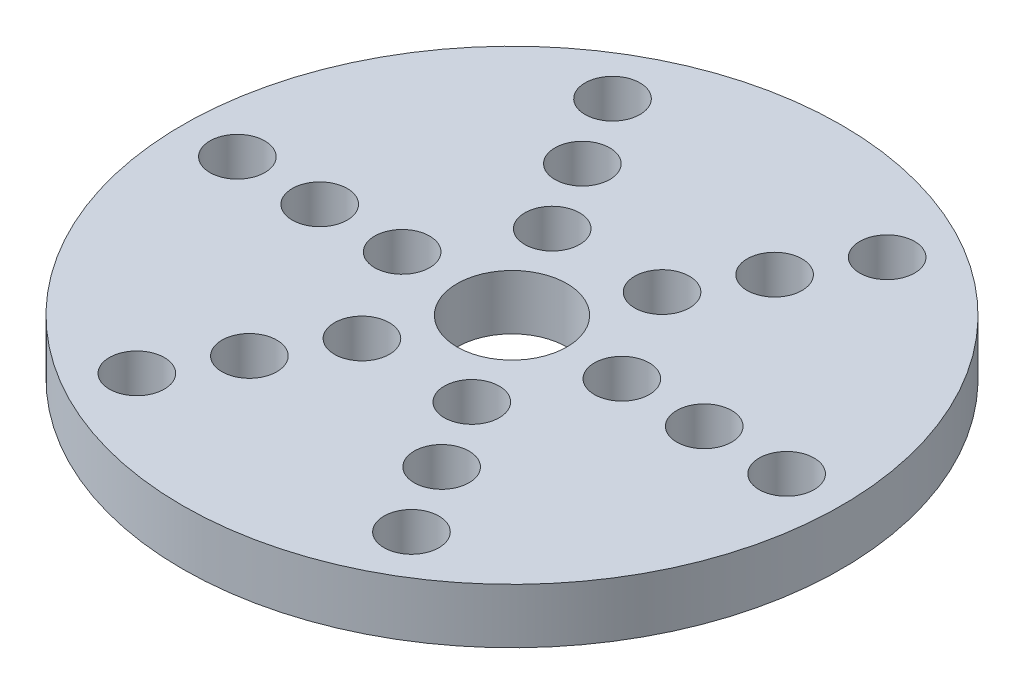
ISO-10303-21;
HEADER;
FILE_DESCRIPTION(('STEP AP214'),'2;1');
FILE_NAME('part.step','',(''),(''),'','','');
FILE_SCHEMA(('AUTOMOTIVE_DESIGN { 1 0 10303 214 1 1 1 1 }'));
ENDSEC;
DATA;
#1=APPLICATION_CONTEXT('core data for automotive mechanical design processes');
#2=APPLICATION_PROTOCOL_DEFINITION('international standard','automotive_design',2000,#1);
#3=PRODUCT_CONTEXT('',#1,'mechanical');
#4=PRODUCT('Part','Part','',(#3));
#5=PRODUCT_RELATED_PRODUCT_CATEGORY('part','',(#4));
#6=PRODUCT_DEFINITION_FORMATION('','',#4);
#7=PRODUCT_DEFINITION_CONTEXT('part definition',#1,'design');
#8=PRODUCT_DEFINITION('design','',#6,#7);
#9=PRODUCT_DEFINITION_SHAPE('','',#8);
#10=(LENGTH_UNIT() NAMED_UNIT(*) SI_UNIT(.MILLI.,.METRE.));
#11=(NAMED_UNIT(*) PLANE_ANGLE_UNIT() SI_UNIT($,.RADIAN.));
#12=(NAMED_UNIT(*) SI_UNIT($,.STERADIAN.) SOLID_ANGLE_UNIT());
#13=UNCERTAINTY_MEASURE_WITH_UNIT(LENGTH_MEASURE(1.E-05),#10,'distance_accuracy_value','');
#14=(GEOMETRIC_REPRESENTATION_CONTEXT(3) GLOBAL_UNCERTAINTY_ASSIGNED_CONTEXT((#13)) GLOBAL_UNIT_ASSIGNED_CONTEXT((#10,
#11,#12)) REPRESENTATION_CONTEXT('',''));
#15=CARTESIAN_POINT('',(0.,0.,0.));
#16=DIRECTION('',(0.,0.,1.));
#17=DIRECTION('',(1.,0.,0.));
#18=AXIS2_PLACEMENT_3D('',#15,#16,#17);
#19=CARTESIAN_POINT('',(0.,10.,0.));
#20=DIRECTION('',(0.,1.,0.));
#21=DIRECTION('',(0.,0.,1.));
#22=AXIS2_PLACEMENT_3D('',#19,#20,#21);
#23=PLANE('',#22);
#24=CARTESIAN_POINT('',(17.5000000000004,10.,-30.3108891324552));
#25=DIRECTION('',(0.,1.,0.));
#26=DIRECTION('',(0.,0.,1.));
#27=AXIS2_PLACEMENT_3D('',#24,#25,#26);
#28=CIRCLE('',#27,5.);
#29=CARTESIAN_POINT('',(17.5000000000004,10.,-25.3108891324552));
#30=VERTEX_POINT('',#29);
#31=EDGE_CURVE('E147',#30,#30,#28,.T.);
#32=ORIENTED_EDGE('',*,*,#31,.F.);
#33=EDGE_LOOP('',(#32));
#34=FACE_BOUND('',#33,.T.);
#35=CARTESIAN_POINT('',(-24.9999999999996,10.,-43.3012701892222));
#36=DIRECTION('',(0.,1.,0.));
#37=DIRECTION('',(0.,0.,1.));
#38=AXIS2_PLACEMENT_3D('',#35,#36,#37);
#39=CIRCLE('',#38,4.99999999999999);
#40=CARTESIAN_POINT('',(-24.9999999999996,10.,-38.3012701892222));
#41=VERTEX_POINT('',#40);
#42=EDGE_CURVE('E135',#41,#41,#39,.T.);
#43=ORIENTED_EDGE('',*,*,#42,.F.);
#44=EDGE_LOOP('',(#43));
#45=FACE_BOUND('',#44,.T.);
#46=CARTESIAN_POINT('',(-9.9999999999997,10.,-17.3205080756891));
#47=DIRECTION('',(0.,1.,0.));
#48=DIRECTION('',(0.,0.,1.));
#49=AXIS2_PLACEMENT_3D('',#46,#47,#48);
#50=CIRCLE('',#49,4.99999999999994);
#51=CARTESIAN_POINT('',(-9.9999999999997,10.,-12.3205080756892));
#52=VERTEX_POINT('',#51);
#53=EDGE_CURVE('E123',#52,#52,#50,.T.);
#54=ORIENTED_EDGE('',*,*,#53,.F.);
#55=EDGE_LOOP('',(#54));
#56=FACE_BOUND('',#55,.T.);
#57=CARTESIAN_POINT('',(-35.,10.,-2.44403693719019E-13));
#58=DIRECTION('',(0.,1.,0.));
#59=DIRECTION('',(0.,0.,1.));
#60=AXIS2_PLACEMENT_3D('',#57,#58,#59);
#61=CIRCLE('',#60,4.99999999999999);
#62=CARTESIAN_POINT('',(-35.,10.,4.99999999999975));
#63=VERTEX_POINT('',#62);
#64=EDGE_CURVE('E111',#63,#63,#61,.T.);
#65=ORIENTED_EDGE('',*,*,#64,.F.);
#66=EDGE_LOOP('',(#65));
#67=FACE_BOUND('',#66,.T.);
#68=CARTESIAN_POINT('',(-25.0000000000002,10.,43.3012701892218));
#69=DIRECTION('',(0.,1.,0.));
#70=DIRECTION('',(0.,0.,1.));
#71=AXIS2_PLACEMENT_3D('',#68,#69,#70);
#72=CIRCLE('',#71,5.);
#73=CARTESIAN_POINT('',(-25.0000000000002,10.,48.3012701892218));
#74=VERTEX_POINT('',#73);
#75=EDGE_CURVE('E99',#74,#74,#72,.T.);
#76=ORIENTED_EDGE('',*,*,#75,.F.);
#77=EDGE_LOOP('',(#76));
#78=FACE_BOUND('',#77,.T.);
#79=CARTESIAN_POINT('',(-10.0000000000001,10.,17.3205080756885));
#80=DIRECTION('',(0.,1.,0.));
#81=DIRECTION('',(0.,0.,1.));
#82=AXIS2_PLACEMENT_3D('',#79,#80,#81);
#83=CIRCLE('',#82,5.00000000000019);
#84=CARTESIAN_POINT('',(-10.0000000000001,10.,22.3205080756887));
#85=VERTEX_POINT('',#84);
#86=EDGE_CURVE('E87',#85,#85,#83,.T.);
#87=ORIENTED_EDGE('',*,*,#86,.F.);
#88=EDGE_LOOP('',(#87));
#89=FACE_BOUND('',#88,.T.);
#90=CARTESIAN_POINT('',(17.4999999999999,10.,30.3108891324554));
#91=DIRECTION('',(0.,1.,0.));
#92=DIRECTION('',(0.,0.,1.));
#93=AXIS2_PLACEMENT_3D('',#90,#91,#92);
#94=CIRCLE('',#93,5.);
#95=CARTESIAN_POINT('',(17.4999999999999,10.,35.3108891324554));
#96=VERTEX_POINT('',#95);
#97=EDGE_CURVE('E75',#96,#96,#94,.T.);
#98=ORIENTED_EDGE('',*,*,#97,.F.);
#99=EDGE_LOOP('',(#98));
#100=FACE_BOUND('',#99,.T.);
#101=CARTESIAN_POINT('',(50.,10.,0.));
#102=DIRECTION('',(0.,1.,0.));
#103=DIRECTION('',(0.,0.,1.));
#104=AXIS2_PLACEMENT_3D('',#101,#102,#103);
#105=CIRCLE('',#104,5.);
#106=CARTESIAN_POINT('',(50.,10.,5.));
#107=VERTEX_POINT('',#106);
#108=EDGE_CURVE('E63',#107,#107,#105,.T.);
#109=ORIENTED_EDGE('',*,*,#108,.F.);
#110=EDGE_LOOP('',(#109));
#111=FACE_BOUND('',#110,.T.);
#112=CARTESIAN_POINT('',(20.,10.,0.));
#113=DIRECTION('',(0.,1.,0.));
#114=DIRECTION('',(0.,0.,1.));
#115=AXIS2_PLACEMENT_3D('',#112,#113,#114);
#116=CIRCLE('',#115,5.);
#117=CARTESIAN_POINT('',(20.,10.,5.));
#118=VERTEX_POINT('',#117);
#119=EDGE_CURVE('E51',#118,#118,#116,.T.);
#120=ORIENTED_EDGE('',*,*,#119,.F.);
#121=EDGE_LOOP('',(#120));
#122=FACE_BOUND('',#121,.T.);
#123=CARTESIAN_POINT('',(0.,10.,0.));
#124=DIRECTION('',(0.,1.,0.));
#125=DIRECTION('',(0.,0.,1.));
#126=AXIS2_PLACEMENT_3D('',#123,#124,#125);
#127=CIRCLE('',#126,60.);
#128=CARTESIAN_POINT('',(0.,10.,60.));
#129=VERTEX_POINT('',#128);
#130=EDGE_CURVE('E10',#129,#129,#127,.T.);
#131=ORIENTED_EDGE('',*,*,#130,.T.);
#132=EDGE_LOOP('',(#131));
#133=FACE_BOUND('',#132,.T.);
#134=CARTESIAN_POINT('',(0.,10.,0.));
#135=DIRECTION('',(0.,1.,0.));
#136=DIRECTION('',(0.,0.,1.));
#137=AXIS2_PLACEMENT_3D('',#134,#135,#136);
#138=CIRCLE('',#137,10.);
#139=CARTESIAN_POINT('',(0.,10.,10.));
#140=VERTEX_POINT('',#139);
#141=EDGE_CURVE('E46',#140,#140,#138,.T.);
#142=ORIENTED_EDGE('',*,*,#141,.F.);
#143=EDGE_LOOP('',(#142));
#144=FACE_BOUND('',#143,.T.);
#145=CARTESIAN_POINT('',(35.,10.,0.));
#146=DIRECTION('',(0.,1.,0.));
#147=DIRECTION('',(0.,0.,1.));
#148=AXIS2_PLACEMENT_3D('',#145,#146,#147);
#149=CIRCLE('',#148,5.);
#150=CARTESIAN_POINT('',(35.,10.,5.));
#151=VERTEX_POINT('',#150);
#152=EDGE_CURVE('E57',#151,#151,#149,.T.);
#153=ORIENTED_EDGE('',*,*,#152,.F.);
#154=EDGE_LOOP('',(#153));
#155=FACE_BOUND('',#154,.T.);
#156=CARTESIAN_POINT('',(9.99999999999985,10.,17.3205080756887));
#157=DIRECTION('',(0.,1.,0.));
#158=DIRECTION('',(0.,0.,1.));
#159=AXIS2_PLACEMENT_3D('',#156,#157,#158);
#160=CIRCLE('',#159,5.00000000000015);
#161=CARTESIAN_POINT('',(9.99999999999985,10.,22.3205080756888));
#162=VERTEX_POINT('',#161);
#163=EDGE_CURVE('E69',#162,#162,#160,.T.);
#164=ORIENTED_EDGE('',*,*,#163,.F.);
#165=EDGE_LOOP('',(#164));
#166=FACE_BOUND('',#165,.T.);
#167=CARTESIAN_POINT('',(24.9999999999999,10.,43.301270189222));
#168=DIRECTION('',(0.,1.,0.));
#169=DIRECTION('',(0.,0.,1.));
#170=AXIS2_PLACEMENT_3D('',#167,#168,#169);
#171=CIRCLE('',#170,5.);
#172=CARTESIAN_POINT('',(24.9999999999999,10.,48.301270189222));
#173=VERTEX_POINT('',#172);
#174=EDGE_CURVE('E81',#173,#173,#171,.T.);
#175=ORIENTED_EDGE('',*,*,#174,.F.);
#176=EDGE_LOOP('',(#175));
#177=FACE_BOUND('',#176,.T.);
#178=CARTESIAN_POINT('',(-17.5000000000001,10.,30.3108891324553));
#179=DIRECTION('',(0.,1.,0.));
#180=DIRECTION('',(0.,0.,1.));
#181=AXIS2_PLACEMENT_3D('',#178,#179,#180);
#182=CIRCLE('',#181,5.);
#183=CARTESIAN_POINT('',(-17.5000000000001,10.,35.3108891324553));
#184=VERTEX_POINT('',#183);
#185=EDGE_CURVE('E93',#184,#184,#182,.T.);
#186=ORIENTED_EDGE('',*,*,#185,.F.);
#187=EDGE_LOOP('',(#186));
#188=FACE_BOUND('',#187,.T.);
#189=CARTESIAN_POINT('',(-20.,10.,-1.39659253553725E-13));
#190=DIRECTION('',(0.,1.,0.));
#191=DIRECTION('',(0.,0.,1.));
#192=AXIS2_PLACEMENT_3D('',#189,#190,#191);
#193=CIRCLE('',#192,5.);
#194=CARTESIAN_POINT('',(-20.,10.,4.99999999999986));
#195=VERTEX_POINT('',#194);
#196=EDGE_CURVE('E105',#195,#195,#193,.T.);
#197=ORIENTED_EDGE('',*,*,#196,.F.);
#198=EDGE_LOOP('',(#197));
#199=FACE_BOUND('',#198,.T.);
#200=CARTESIAN_POINT('',(-50.,10.,-3.49148133884313E-13));
#201=DIRECTION('',(0.,1.,0.));
#202=DIRECTION('',(0.,0.,1.));
#203=AXIS2_PLACEMENT_3D('',#200,#201,#202);
#204=CIRCLE('',#203,4.99999999999999);
#205=CARTESIAN_POINT('',(-50.,10.,4.99999999999964));
#206=VERTEX_POINT('',#205);
#207=EDGE_CURVE('E117',#206,#206,#204,.T.);
#208=ORIENTED_EDGE('',*,*,#207,.F.);
#209=EDGE_LOOP('',(#208));
#210=FACE_BOUND('',#209,.T.);
#211=CARTESIAN_POINT('',(-17.4999999999997,10.,-30.3108891324555));
#212=DIRECTION('',(0.,1.,0.));
#213=DIRECTION('',(0.,0.,1.));
#214=AXIS2_PLACEMENT_3D('',#211,#212,#213);
#215=CIRCLE('',#214,5.);
#216=CARTESIAN_POINT('',(-17.4999999999997,10.,-25.3108891324555));
#217=VERTEX_POINT('',#216);
#218=EDGE_CURVE('E129',#217,#217,#215,.T.);
#219=ORIENTED_EDGE('',*,*,#218,.F.);
#220=EDGE_LOOP('',(#219));
#221=FACE_BOUND('',#220,.T.);
#222=CARTESIAN_POINT('',(10.0000000000001,10.,-17.3205080756889));
#223=DIRECTION('',(0.,1.,0.));
#224=DIRECTION('',(0.,0.,1.));
#225=AXIS2_PLACEMENT_3D('',#222,#223,#224);
#226=CIRCLE('',#225,4.99999999999981);
#227=CARTESIAN_POINT('',(10.0000000000001,10.,-12.3205080756891));
#228=VERTEX_POINT('',#227);
#229=EDGE_CURVE('E141',#228,#228,#226,.T.);
#230=ORIENTED_EDGE('',*,*,#229,.F.);
#231=EDGE_LOOP('',(#230));
#232=FACE_BOUND('',#231,.T.);
#233=CARTESIAN_POINT('',(25.0000000000005,10.,-43.3012701892216));
#234=DIRECTION('',(0.,1.,0.));
#235=DIRECTION('',(0.,0.,1.));
#236=AXIS2_PLACEMENT_3D('',#233,#234,#235);
#237=CIRCLE('',#236,5.);
#238=CARTESIAN_POINT('',(25.0000000000005,10.,-38.3012701892216));
#239=VERTEX_POINT('',#238);
#240=EDGE_CURVE('E153',#239,#239,#237,.T.);
#241=ORIENTED_EDGE('',*,*,#240,.F.);
#242=EDGE_LOOP('',(#241));
#243=FACE_BOUND('',#242,.T.);
#244=ADVANCED_FACE('F35',(#34,#45,#56,#67,#78,#89,#100,#111,#122,#133,#144,#155,#166,#177,#188,
#199,#210,#221,#232,#243),#23,.T.);
#245=CARTESIAN_POINT('',(0.,0.,0.));
#246=DIRECTION('',(0.,1.,0.));
#247=DIRECTION('',(0.,0.,1.));
#248=AXIS2_PLACEMENT_3D('',#245,#246,#247);
#249=PLANE('',#248);
#250=CARTESIAN_POINT('',(0.,0.,0.));
#251=DIRECTION('',(0.,1.,0.));
#252=DIRECTION('',(0.,0.,1.));
#253=AXIS2_PLACEMENT_3D('',#250,#251,#252);
#254=CIRCLE('',#253,60.);
#255=CARTESIAN_POINT('',(0.,0.,60.));
#256=VERTEX_POINT('',#255);
#257=EDGE_CURVE('E39',#256,#256,#254,.T.);
#258=ORIENTED_EDGE('',*,*,#257,.F.);
#259=EDGE_LOOP('',(#258));
#260=FACE_BOUND('',#259,.T.);
#261=CARTESIAN_POINT('',(0.,0.,0.));
#262=DIRECTION('',(0.,1.,0.));
#263=DIRECTION('',(0.,0.,1.));
#264=AXIS2_PLACEMENT_3D('',#261,#262,#263);
#265=CIRCLE('',#264,10.);
#266=CARTESIAN_POINT('',(0.,0.,10.));
#267=VERTEX_POINT('',#266);
#268=EDGE_CURVE('E48',#267,#267,#265,.T.);
#269=ORIENTED_EDGE('',*,*,#268,.T.);
#270=EDGE_LOOP('',(#269));
#271=FACE_BOUND('',#270,.T.);
#272=CARTESIAN_POINT('',(20.,0.,0.));
#273=DIRECTION('',(0.,1.,0.));
#274=DIRECTION('',(0.,0.,1.));
#275=AXIS2_PLACEMENT_3D('',#272,#273,#274);
#276=CIRCLE('',#275,5.);
#277=CARTESIAN_POINT('',(20.,0.,5.));
#278=VERTEX_POINT('',#277);
#279=EDGE_CURVE('E54',#278,#278,#276,.T.);
#280=ORIENTED_EDGE('',*,*,#279,.T.);
#281=EDGE_LOOP('',(#280));
#282=FACE_BOUND('',#281,.T.);
#283=CARTESIAN_POINT('',(35.,0.,0.));
#284=DIRECTION('',(0.,1.,0.));
#285=DIRECTION('',(0.,0.,1.));
#286=AXIS2_PLACEMENT_3D('',#283,#284,#285);
#287=CIRCLE('',#286,5.);
#288=CARTESIAN_POINT('',(35.,0.,5.));
#289=VERTEX_POINT('',#288);
#290=EDGE_CURVE('E60',#289,#289,#287,.T.);
#291=ORIENTED_EDGE('',*,*,#290,.T.);
#292=EDGE_LOOP('',(#291));
#293=FACE_BOUND('',#292,.T.);
#294=CARTESIAN_POINT('',(50.,0.,0.));
#295=DIRECTION('',(0.,1.,0.));
#296=DIRECTION('',(0.,0.,1.));
#297=AXIS2_PLACEMENT_3D('',#294,#295,#296);
#298=CIRCLE('',#297,5.);
#299=CARTESIAN_POINT('',(50.,0.,5.));
#300=VERTEX_POINT('',#299);
#301=EDGE_CURVE('E66',#300,#300,#298,.T.);
#302=ORIENTED_EDGE('',*,*,#301,.T.);
#303=EDGE_LOOP('',(#302));
#304=FACE_BOUND('',#303,.T.);
#305=CARTESIAN_POINT('',(9.99999999999985,0.,17.3205080756887));
#306=DIRECTION('',(0.,1.,0.));
#307=DIRECTION('',(0.,0.,1.));
#308=AXIS2_PLACEMENT_3D('',#305,#306,#307);
#309=CIRCLE('',#308,5.00000000000015);
#310=CARTESIAN_POINT('',(9.99999999999985,0.,22.3205080756888));
#311=VERTEX_POINT('',#310);
#312=EDGE_CURVE('E72',#311,#311,#309,.T.);
#313=ORIENTED_EDGE('',*,*,#312,.T.);
#314=EDGE_LOOP('',(#313));
#315=FACE_BOUND('',#314,.T.);
#316=CARTESIAN_POINT('',(17.4999999999999,0.,30.3108891324554));
#317=DIRECTION('',(0.,1.,0.));
#318=DIRECTION('',(0.,0.,1.));
#319=AXIS2_PLACEMENT_3D('',#316,#317,#318);
#320=CIRCLE('',#319,5.);
#321=CARTESIAN_POINT('',(17.4999999999999,0.,35.3108891324554));
#322=VERTEX_POINT('',#321);
#323=EDGE_CURVE('E78',#322,#322,#320,.T.);
#324=ORIENTED_EDGE('',*,*,#323,.T.);
#325=EDGE_LOOP('',(#324));
#326=FACE_BOUND('',#325,.T.);
#327=CARTESIAN_POINT('',(24.9999999999999,0.,43.301270189222));
#328=DIRECTION('',(0.,1.,0.));
#329=DIRECTION('',(0.,0.,1.));
#330=AXIS2_PLACEMENT_3D('',#327,#328,#329);
#331=CIRCLE('',#330,5.);
#332=CARTESIAN_POINT('',(24.9999999999999,0.,48.301270189222));
#333=VERTEX_POINT('',#332);
#334=EDGE_CURVE('E84',#333,#333,#331,.T.);
#335=ORIENTED_EDGE('',*,*,#334,.T.);
#336=EDGE_LOOP('',(#335));
#337=FACE_BOUND('',#336,.T.);
#338=CARTESIAN_POINT('',(-10.0000000000001,0.,17.3205080756885));
#339=DIRECTION('',(0.,1.,0.));
#340=DIRECTION('',(0.,0.,1.));
#341=AXIS2_PLACEMENT_3D('',#338,#339,#340);
#342=CIRCLE('',#341,5.00000000000019);
#343=CARTESIAN_POINT('',(-10.0000000000001,0.,22.3205080756887));
#344=VERTEX_POINT('',#343);
#345=EDGE_CURVE('E90',#344,#344,#342,.T.);
#346=ORIENTED_EDGE('',*,*,#345,.T.);
#347=EDGE_LOOP('',(#346));
#348=FACE_BOUND('',#347,.T.);
#349=CARTESIAN_POINT('',(-17.5000000000001,0.,30.3108891324553));
#350=DIRECTION('',(0.,1.,0.));
#351=DIRECTION('',(0.,0.,1.));
#352=AXIS2_PLACEMENT_3D('',#349,#350,#351);
#353=CIRCLE('',#352,5.);
#354=CARTESIAN_POINT('',(-17.5000000000001,0.,35.3108891324553));
#355=VERTEX_POINT('',#354);
#356=EDGE_CURVE('E96',#355,#355,#353,.T.);
#357=ORIENTED_EDGE('',*,*,#356,.T.);
#358=EDGE_LOOP('',(#357));
#359=FACE_BOUND('',#358,.T.);
#360=CARTESIAN_POINT('',(-25.0000000000002,0.,43.3012701892218));
#361=DIRECTION('',(0.,1.,0.));
#362=DIRECTION('',(0.,0.,1.));
#363=AXIS2_PLACEMENT_3D('',#360,#361,#362);
#364=CIRCLE('',#363,5.);
#365=CARTESIAN_POINT('',(-25.0000000000002,0.,48.3012701892218));
#366=VERTEX_POINT('',#365);
#367=EDGE_CURVE('E102',#366,#366,#364,.T.);
#368=ORIENTED_EDGE('',*,*,#367,.T.);
#369=EDGE_LOOP('',(#368));
#370=FACE_BOUND('',#369,.T.);
#371=CARTESIAN_POINT('',(-20.,0.,-1.39659253553725E-13));
#372=DIRECTION('',(0.,1.,0.));
#373=DIRECTION('',(0.,0.,1.));
#374=AXIS2_PLACEMENT_3D('',#371,#372,#373);
#375=CIRCLE('',#374,5.);
#376=CARTESIAN_POINT('',(-20.,0.,4.99999999999986));
#377=VERTEX_POINT('',#376);
#378=EDGE_CURVE('E108',#377,#377,#375,.T.);
#379=ORIENTED_EDGE('',*,*,#378,.T.);
#380=EDGE_LOOP('',(#379));
#381=FACE_BOUND('',#380,.T.);
#382=CARTESIAN_POINT('',(-35.,0.,-2.44403693719019E-13));
#383=DIRECTION('',(0.,1.,0.));
#384=DIRECTION('',(0.,0.,1.));
#385=AXIS2_PLACEMENT_3D('',#382,#383,#384);
#386=CIRCLE('',#385,4.99999999999999);
#387=CARTESIAN_POINT('',(-35.,0.,4.99999999999975));
#388=VERTEX_POINT('',#387);
#389=EDGE_CURVE('E114',#388,#388,#386,.T.);
#390=ORIENTED_EDGE('',*,*,#389,.T.);
#391=EDGE_LOOP('',(#390));
#392=FACE_BOUND('',#391,.T.);
#393=CARTESIAN_POINT('',(-50.,0.,-3.49148133884313E-13));
#394=DIRECTION('',(0.,1.,0.));
#395=DIRECTION('',(0.,0.,1.));
#396=AXIS2_PLACEMENT_3D('',#393,#394,#395);
#397=CIRCLE('',#396,4.99999999999999);
#398=CARTESIAN_POINT('',(-50.,0.,4.99999999999964));
#399=VERTEX_POINT('',#398);
#400=EDGE_CURVE('E120',#399,#399,#397,.T.);
#401=ORIENTED_EDGE('',*,*,#400,.T.);
#402=EDGE_LOOP('',(#401));
#403=FACE_BOUND('',#402,.T.);
#404=CARTESIAN_POINT('',(-9.9999999999997,0.,-17.3205080756891));
#405=DIRECTION('',(0.,1.,0.));
#406=DIRECTION('',(0.,0.,1.));
#407=AXIS2_PLACEMENT_3D('',#404,#405,#406);
#408=CIRCLE('',#407,4.99999999999994);
#409=CARTESIAN_POINT('',(-9.9999999999997,0.,-12.3205080756892));
#410=VERTEX_POINT('',#409);
#411=EDGE_CURVE('E126',#410,#410,#408,.T.);
#412=ORIENTED_EDGE('',*,*,#411,.T.);
#413=EDGE_LOOP('',(#412));
#414=FACE_BOUND('',#413,.T.);
#415=CARTESIAN_POINT('',(-17.4999999999997,0.,-30.3108891324555));
#416=DIRECTION('',(0.,1.,0.));
#417=DIRECTION('',(0.,0.,1.));
#418=AXIS2_PLACEMENT_3D('',#415,#416,#417);
#419=CIRCLE('',#418,5.);
#420=CARTESIAN_POINT('',(-17.4999999999997,0.,-25.3108891324555));
#421=VERTEX_POINT('',#420);
#422=EDGE_CURVE('E132',#421,#421,#419,.T.);
#423=ORIENTED_EDGE('',*,*,#422,.T.);
#424=EDGE_LOOP('',(#423));
#425=FACE_BOUND('',#424,.T.);
#426=CARTESIAN_POINT('',(-24.9999999999996,0.,-43.3012701892222));
#427=DIRECTION('',(0.,1.,0.));
#428=DIRECTION('',(0.,0.,1.));
#429=AXIS2_PLACEMENT_3D('',#426,#427,#428);
#430=CIRCLE('',#429,4.99999999999999);
#431=CARTESIAN_POINT('',(-24.9999999999996,0.,-38.3012701892222));
#432=VERTEX_POINT('',#431);
#433=EDGE_CURVE('E138',#432,#432,#430,.T.);
#434=ORIENTED_EDGE('',*,*,#433,.T.);
#435=EDGE_LOOP('',(#434));
#436=FACE_BOUND('',#435,.T.);
#437=CARTESIAN_POINT('',(10.0000000000001,0.,-17.3205080756889));
#438=DIRECTION('',(0.,1.,0.));
#439=DIRECTION('',(0.,0.,1.));
#440=AXIS2_PLACEMENT_3D('',#437,#438,#439);
#441=CIRCLE('',#440,4.99999999999981);
#442=CARTESIAN_POINT('',(10.0000000000001,0.,-12.3205080756891));
#443=VERTEX_POINT('',#442);
#444=EDGE_CURVE('E144',#443,#443,#441,.T.);
#445=ORIENTED_EDGE('',*,*,#444,.T.);
#446=EDGE_LOOP('',(#445));
#447=FACE_BOUND('',#446,.T.);
#448=CARTESIAN_POINT('',(17.5000000000004,0.,-30.3108891324552));
#449=DIRECTION('',(0.,1.,0.));
#450=DIRECTION('',(0.,0.,1.));
#451=AXIS2_PLACEMENT_3D('',#448,#449,#450);
#452=CIRCLE('',#451,5.);
#453=CARTESIAN_POINT('',(17.5000000000004,0.,-25.3108891324552));
#454=VERTEX_POINT('',#453);
#455=EDGE_CURVE('E150',#454,#454,#452,.T.);
#456=ORIENTED_EDGE('',*,*,#455,.T.);
#457=EDGE_LOOP('',(#456));
#458=FACE_BOUND('',#457,.T.);
#459=CARTESIAN_POINT('',(25.0000000000005,0.,-43.3012701892216));
#460=DIRECTION('',(0.,1.,0.));
#461=DIRECTION('',(0.,0.,1.));
#462=AXIS2_PLACEMENT_3D('',#459,#460,#461);
#463=CIRCLE('',#462,5.);
#464=CARTESIAN_POINT('',(25.0000000000005,0.,-38.3012701892216));
#465=VERTEX_POINT('',#464);
#466=EDGE_CURVE('E156',#465,#465,#463,.T.);
#467=ORIENTED_EDGE('',*,*,#466,.T.);
#468=EDGE_LOOP('',(#467));
#469=FACE_BOUND('',#468,.T.);
#470=ADVANCED_FACE('F166',(#260,#271,#282,#293,#304,#315,#326,#337,#348,#359,#370,#381,#392,
#403,#414,#425,#436,#447,#458,#469),#249,.F.);
#471=CARTESIAN_POINT('',(0.,10.,0.));
#472=DIRECTION('',(0.,-1.,0.));
#473=DIRECTION('',(0.,0.,-1.));
#474=AXIS2_PLACEMENT_3D('',#471,#472,#473);
#475=CYLINDRICAL_SURFACE('',#474,60.);
#476=ORIENTED_EDGE('',*,*,#130,.F.);
#477=EDGE_LOOP('',(#476));
#478=FACE_BOUND('',#477,.T.);
#479=ORIENTED_EDGE('',*,*,#257,.T.);
#480=EDGE_LOOP('',(#479));
#481=FACE_BOUND('',#480,.T.);
#482=ADVANCED_FACE('F37',(#478,#481),#475,.T.);
#483=CARTESIAN_POINT('',(0.,10.,0.));
#484=DIRECTION('',(0.,-1.,0.));
#485=DIRECTION('',(0.,0.,-1.));
#486=AXIS2_PLACEMENT_3D('',#483,#484,#485);
#487=CYLINDRICAL_SURFACE('',#486,10.);
#488=ORIENTED_EDGE('',*,*,#141,.T.);
#489=EDGE_LOOP('',(#488));
#490=FACE_BOUND('',#489,.T.);
#491=ORIENTED_EDGE('',*,*,#268,.F.);
#492=EDGE_LOOP('',(#491));
#493=FACE_BOUND('',#492,.T.);
#494=ADVANCED_FACE('F176',(#490,#493),#487,.F.);
#495=CARTESIAN_POINT('',(20.,10.,0.));
#496=DIRECTION('',(0.,-1.,0.));
#497=DIRECTION('',(0.,0.,-1.));
#498=AXIS2_PLACEMENT_3D('',#495,#496,#497);
#499=CYLINDRICAL_SURFACE('',#498,5.);
#500=ORIENTED_EDGE('',*,*,#119,.T.);
#501=EDGE_LOOP('',(#500));
#502=FACE_BOUND('',#501,.T.);
#503=ORIENTED_EDGE('',*,*,#279,.F.);
#504=EDGE_LOOP('',(#503));
#505=FACE_BOUND('',#504,.T.);
#506=ADVANCED_FACE('F179',(#502,#505),#499,.F.);
#507=CARTESIAN_POINT('',(35.,10.,0.));
#508=DIRECTION('',(0.,-1.,0.));
#509=DIRECTION('',(0.,0.,-1.));
#510=AXIS2_PLACEMENT_3D('',#507,#508,#509);
#511=CYLINDRICAL_SURFACE('',#510,5.);
#512=ORIENTED_EDGE('',*,*,#152,.T.);
#513=EDGE_LOOP('',(#512));
#514=FACE_BOUND('',#513,.T.);
#515=ORIENTED_EDGE('',*,*,#290,.F.);
#516=EDGE_LOOP('',(#515));
#517=FACE_BOUND('',#516,.T.);
#518=ADVANCED_FACE('F183',(#514,#517),#511,.F.);
#519=CARTESIAN_POINT('',(50.,10.,0.));
#520=DIRECTION('',(0.,-1.,0.));
#521=DIRECTION('',(0.,0.,-1.));
#522=AXIS2_PLACEMENT_3D('',#519,#520,#521);
#523=CYLINDRICAL_SURFACE('',#522,5.);
#524=ORIENTED_EDGE('',*,*,#108,.T.);
#525=EDGE_LOOP('',(#524));
#526=FACE_BOUND('',#525,.T.);
#527=ORIENTED_EDGE('',*,*,#301,.F.);
#528=EDGE_LOOP('',(#527));
#529=FACE_BOUND('',#528,.T.);
#530=ADVANCED_FACE('F187',(#526,#529),#523,.F.);
#531=CARTESIAN_POINT('',(9.99999999999985,10.,17.3205080756887));
#532=DIRECTION('',(0.,-1.,0.));
#533=DIRECTION('',(0.,0.,-1.));
#534=AXIS2_PLACEMENT_3D('',#531,#532,#533);
#535=CYLINDRICAL_SURFACE('',#534,5.00000000000015);
#536=ORIENTED_EDGE('',*,*,#163,.T.);
#537=EDGE_LOOP('',(#536));
#538=FACE_BOUND('',#537,.T.);
#539=ORIENTED_EDGE('',*,*,#312,.F.);
#540=EDGE_LOOP('',(#539));
#541=FACE_BOUND('',#540,.T.);
#542=ADVANCED_FACE('F191',(#538,#541),#535,.F.);
#543=CARTESIAN_POINT('',(17.4999999999999,10.,30.3108891324554));
#544=DIRECTION('',(0.,-1.,0.));
#545=DIRECTION('',(0.,0.,-1.));
#546=AXIS2_PLACEMENT_3D('',#543,#544,#545);
#547=CYLINDRICAL_SURFACE('',#546,5.);
#548=ORIENTED_EDGE('',*,*,#97,.T.);
#549=EDGE_LOOP('',(#548));
#550=FACE_BOUND('',#549,.T.);
#551=ORIENTED_EDGE('',*,*,#323,.F.);
#552=EDGE_LOOP('',(#551));
#553=FACE_BOUND('',#552,.T.);
#554=ADVANCED_FACE('F195',(#550,#553),#547,.F.);
#555=CARTESIAN_POINT('',(24.9999999999999,10.,43.301270189222));
#556=DIRECTION('',(0.,-1.,0.));
#557=DIRECTION('',(0.,0.,-1.));
#558=AXIS2_PLACEMENT_3D('',#555,#556,#557);
#559=CYLINDRICAL_SURFACE('',#558,5.);
#560=ORIENTED_EDGE('',*,*,#174,.T.);
#561=EDGE_LOOP('',(#560));
#562=FACE_BOUND('',#561,.T.);
#563=ORIENTED_EDGE('',*,*,#334,.F.);
#564=EDGE_LOOP('',(#563));
#565=FACE_BOUND('',#564,.T.);
#566=ADVANCED_FACE('F199',(#562,#565),#559,.F.);
#567=CARTESIAN_POINT('',(-10.0000000000001,10.,17.3205080756885));
#568=DIRECTION('',(0.,-1.,0.));
#569=DIRECTION('',(0.,0.,-1.));
#570=AXIS2_PLACEMENT_3D('',#567,#568,#569);
#571=CYLINDRICAL_SURFACE('',#570,5.00000000000019);
#572=ORIENTED_EDGE('',*,*,#86,.T.);
#573=EDGE_LOOP('',(#572));
#574=FACE_BOUND('',#573,.T.);
#575=ORIENTED_EDGE('',*,*,#345,.F.);
#576=EDGE_LOOP('',(#575));
#577=FACE_BOUND('',#576,.T.);
#578=ADVANCED_FACE('F203',(#574,#577),#571,.F.);
#579=CARTESIAN_POINT('',(-17.5000000000001,10.,30.3108891324553));
#580=DIRECTION('',(0.,-1.,0.));
#581=DIRECTION('',(0.,0.,-1.));
#582=AXIS2_PLACEMENT_3D('',#579,#580,#581);
#583=CYLINDRICAL_SURFACE('',#582,5.);
#584=ORIENTED_EDGE('',*,*,#185,.T.);
#585=EDGE_LOOP('',(#584));
#586=FACE_BOUND('',#585,.T.);
#587=ORIENTED_EDGE('',*,*,#356,.F.);
#588=EDGE_LOOP('',(#587));
#589=FACE_BOUND('',#588,.T.);
#590=ADVANCED_FACE('F207',(#586,#589),#583,.F.);
#591=CARTESIAN_POINT('',(-25.0000000000002,10.,43.3012701892218));
#592=DIRECTION('',(0.,-1.,0.));
#593=DIRECTION('',(0.,0.,-1.));
#594=AXIS2_PLACEMENT_3D('',#591,#592,#593);
#595=CYLINDRICAL_SURFACE('',#594,5.);
#596=ORIENTED_EDGE('',*,*,#75,.T.);
#597=EDGE_LOOP('',(#596));
#598=FACE_BOUND('',#597,.T.);
#599=ORIENTED_EDGE('',*,*,#367,.F.);
#600=EDGE_LOOP('',(#599));
#601=FACE_BOUND('',#600,.T.);
#602=ADVANCED_FACE('F211',(#598,#601),#595,.F.);
#603=CARTESIAN_POINT('',(-20.,10.,-1.39659253553725E-13));
#604=DIRECTION('',(0.,-1.,0.));
#605=DIRECTION('',(0.,0.,-1.));
#606=AXIS2_PLACEMENT_3D('',#603,#604,#605);
#607=CYLINDRICAL_SURFACE('',#606,5.);
#608=ORIENTED_EDGE('',*,*,#196,.T.);
#609=EDGE_LOOP('',(#608));
#610=FACE_BOUND('',#609,.T.);
#611=ORIENTED_EDGE('',*,*,#378,.F.);
#612=EDGE_LOOP('',(#611));
#613=FACE_BOUND('',#612,.T.);
#614=ADVANCED_FACE('F215',(#610,#613),#607,.F.);
#615=CARTESIAN_POINT('',(-35.,10.,-2.44403693719019E-13));
#616=DIRECTION('',(0.,-1.,0.));
#617=DIRECTION('',(0.,0.,-1.));
#618=AXIS2_PLACEMENT_3D('',#615,#616,#617);
#619=CYLINDRICAL_SURFACE('',#618,4.99999999999999);
#620=ORIENTED_EDGE('',*,*,#64,.T.);
#621=EDGE_LOOP('',(#620));
#622=FACE_BOUND('',#621,.T.);
#623=ORIENTED_EDGE('',*,*,#389,.F.);
#624=EDGE_LOOP('',(#623));
#625=FACE_BOUND('',#624,.T.);
#626=ADVANCED_FACE('F219',(#622,#625),#619,.F.);
#627=CARTESIAN_POINT('',(-50.,10.,-3.49148133884313E-13));
#628=DIRECTION('',(0.,-1.,0.));
#629=DIRECTION('',(0.,0.,-1.));
#630=AXIS2_PLACEMENT_3D('',#627,#628,#629);
#631=CYLINDRICAL_SURFACE('',#630,4.99999999999999);
#632=ORIENTED_EDGE('',*,*,#207,.T.);
#633=EDGE_LOOP('',(#632));
#634=FACE_BOUND('',#633,.T.);
#635=ORIENTED_EDGE('',*,*,#400,.F.);
#636=EDGE_LOOP('',(#635));
#637=FACE_BOUND('',#636,.T.);
#638=ADVANCED_FACE('F223',(#634,#637),#631,.F.);
#639=CARTESIAN_POINT('',(-9.9999999999997,10.,-17.3205080756891));
#640=DIRECTION('',(0.,-1.,0.));
#641=DIRECTION('',(0.,0.,-1.));
#642=AXIS2_PLACEMENT_3D('',#639,#640,#641);
#643=CYLINDRICAL_SURFACE('',#642,4.99999999999994);
#644=ORIENTED_EDGE('',*,*,#53,.T.);
#645=EDGE_LOOP('',(#644));
#646=FACE_BOUND('',#645,.T.);
#647=ORIENTED_EDGE('',*,*,#411,.F.);
#648=EDGE_LOOP('',(#647));
#649=FACE_BOUND('',#648,.T.);
#650=ADVANCED_FACE('F227',(#646,#649),#643,.F.);
#651=CARTESIAN_POINT('',(-17.4999999999997,10.,-30.3108891324555));
#652=DIRECTION('',(0.,-1.,0.));
#653=DIRECTION('',(0.,0.,-1.));
#654=AXIS2_PLACEMENT_3D('',#651,#652,#653);
#655=CYLINDRICAL_SURFACE('',#654,5.);
#656=ORIENTED_EDGE('',*,*,#218,.T.);
#657=EDGE_LOOP('',(#656));
#658=FACE_BOUND('',#657,.T.);
#659=ORIENTED_EDGE('',*,*,#422,.F.);
#660=EDGE_LOOP('',(#659));
#661=FACE_BOUND('',#660,.T.);
#662=ADVANCED_FACE('F231',(#658,#661),#655,.F.);
#663=CARTESIAN_POINT('',(-24.9999999999996,10.,-43.3012701892222));
#664=DIRECTION('',(0.,-1.,0.));
#665=DIRECTION('',(0.,0.,-1.));
#666=AXIS2_PLACEMENT_3D('',#663,#664,#665);
#667=CYLINDRICAL_SURFACE('',#666,4.99999999999999);
#668=ORIENTED_EDGE('',*,*,#42,.T.);
#669=EDGE_LOOP('',(#668));
#670=FACE_BOUND('',#669,.T.);
#671=ORIENTED_EDGE('',*,*,#433,.F.);
#672=EDGE_LOOP('',(#671));
#673=FACE_BOUND('',#672,.T.);
#674=ADVANCED_FACE('F235',(#670,#673),#667,.F.);
#675=CARTESIAN_POINT('',(10.0000000000001,10.,-17.3205080756889));
#676=DIRECTION('',(0.,-1.,0.));
#677=DIRECTION('',(0.,0.,-1.));
#678=AXIS2_PLACEMENT_3D('',#675,#676,#677);
#679=CYLINDRICAL_SURFACE('',#678,4.99999999999981);
#680=ORIENTED_EDGE('',*,*,#229,.T.);
#681=EDGE_LOOP('',(#680));
#682=FACE_BOUND('',#681,.T.);
#683=ORIENTED_EDGE('',*,*,#444,.F.);
#684=EDGE_LOOP('',(#683));
#685=FACE_BOUND('',#684,.T.);
#686=ADVANCED_FACE('F239',(#682,#685),#679,.F.);
#687=CARTESIAN_POINT('',(17.5000000000004,10.,-30.3108891324552));
#688=DIRECTION('',(0.,-1.,0.));
#689=DIRECTION('',(0.,0.,-1.));
#690=AXIS2_PLACEMENT_3D('',#687,#688,#689);
#691=CYLINDRICAL_SURFACE('',#690,5.);
#692=ORIENTED_EDGE('',*,*,#31,.T.);
#693=EDGE_LOOP('',(#692));
#694=FACE_BOUND('',#693,.T.);
#695=ORIENTED_EDGE('',*,*,#455,.F.);
#696=EDGE_LOOP('',(#695));
#697=FACE_BOUND('',#696,.T.);
#698=ADVANCED_FACE('F243',(#694,#697),#691,.F.);
#699=CARTESIAN_POINT('',(25.0000000000005,10.,-43.3012701892216));
#700=DIRECTION('',(0.,-1.,0.));
#701=DIRECTION('',(0.,0.,-1.));
#702=AXIS2_PLACEMENT_3D('',#699,#700,#701);
#703=CYLINDRICAL_SURFACE('',#702,5.);
#704=ORIENTED_EDGE('',*,*,#240,.T.);
#705=EDGE_LOOP('',(#704));
#706=FACE_BOUND('',#705,.T.);
#707=ORIENTED_EDGE('',*,*,#466,.F.);
#708=EDGE_LOOP('',(#707));
#709=FACE_BOUND('',#708,.T.);
#710=ADVANCED_FACE('F162',(#706,#709),#703,.F.);
#711=CLOSED_SHELL('',(#244,#470,#482,#494,#506,#518,#530,#542,#554,#566,#578,#590,#602,#614,
#626,#638,#650,#662,#674,#686,#698,#710));
#712=MANIFOLD_SOLID_BREP('B2',#711);
#713=ADVANCED_BREP_SHAPE_REPRESENTATION('',(#18,#712),#14);
#714=SHAPE_DEFINITION_REPRESENTATION(#9,#713);
ENDSEC;
END-ISO-10303-21;
